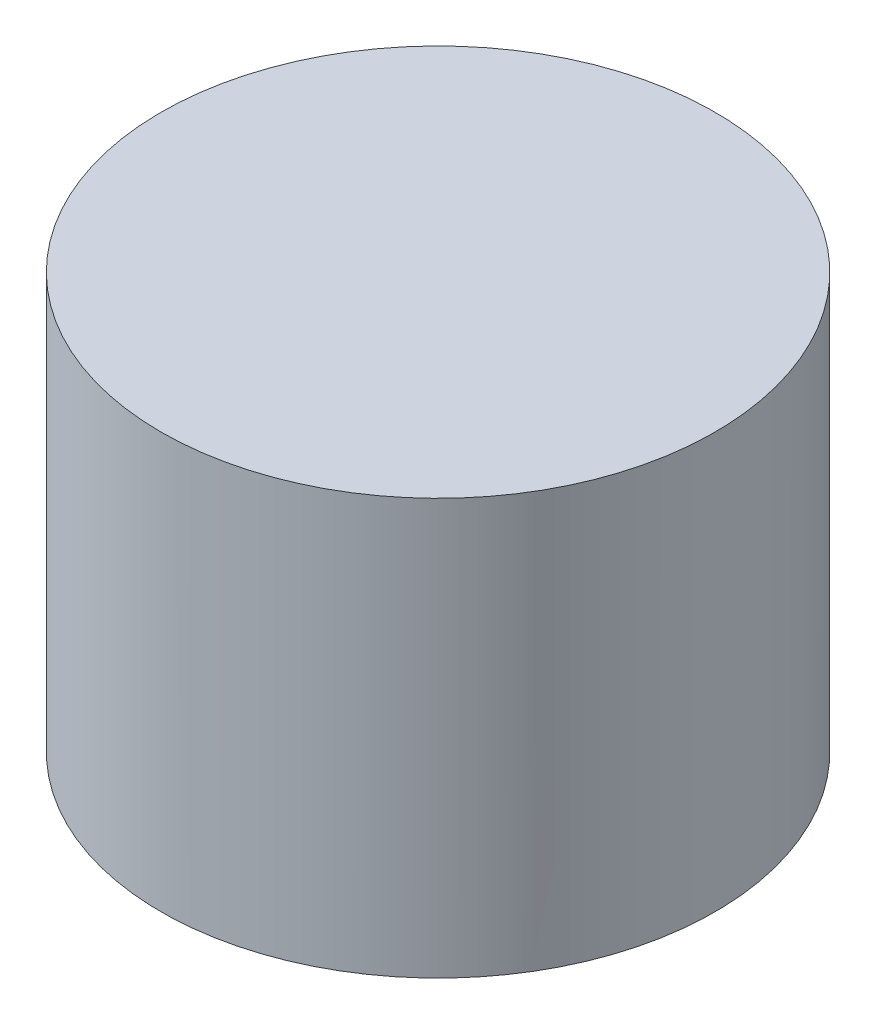
ISO-10303-21;
HEADER;
FILE_DESCRIPTION(('STEP AP214'),'2;1');
FILE_NAME('part.step','',(''),(''),'','','');
FILE_SCHEMA(('AUTOMOTIVE_DESIGN { 1 0 10303 214 1 1 1 1 }'));
ENDSEC;
DATA;
#1=APPLICATION_CONTEXT('core data for automotive mechanical design processes');
#2=APPLICATION_PROTOCOL_DEFINITION('international standard','automotive_design',2000,#1);
#3=PRODUCT_CONTEXT('',#1,'mechanical');
#4=PRODUCT('Part','Part','',(#3));
#5=PRODUCT_RELATED_PRODUCT_CATEGORY('part','',(#4));
#6=PRODUCT_DEFINITION_FORMATION('','',#4);
#7=PRODUCT_DEFINITION_CONTEXT('part definition',#1,'design');
#8=PRODUCT_DEFINITION('design','',#6,#7);
#9=PRODUCT_DEFINITION_SHAPE('','',#8);
#10=(LENGTH_UNIT() NAMED_UNIT(*) SI_UNIT(.MILLI.,.METRE.));
#11=(NAMED_UNIT(*) PLANE_ANGLE_UNIT() SI_UNIT($,.RADIAN.));
#12=(NAMED_UNIT(*) SI_UNIT($,.STERADIAN.) SOLID_ANGLE_UNIT());
#13=UNCERTAINTY_MEASURE_WITH_UNIT(LENGTH_MEASURE(1.E-05),#10,'distance_accuracy_value','');
#14=(GEOMETRIC_REPRESENTATION_CONTEXT(3) GLOBAL_UNCERTAINTY_ASSIGNED_CONTEXT((#13)) GLOBAL_UNIT_ASSIGNED_CONTEXT((#10,
#11,#12)) REPRESENTATION_CONTEXT('',''));
#15=CARTESIAN_POINT('',(0.,0.,0.));
#16=DIRECTION('',(0.,0.,1.));
#17=DIRECTION('',(1.,0.,0.));
#18=AXIS2_PLACEMENT_3D('',#15,#16,#17);
#19=CARTESIAN_POINT('',(0.,0.,0.));
#20=DIRECTION('',(0.,1.,0.));
#21=DIRECTION('',(0.,0.,1.));
#22=AXIS2_PLACEMENT_3D('',#19,#20,#21);
#23=PLANE('',#22);
#24=CARTESIAN_POINT('',(0.,0.,0.));
#25=DIRECTION('',(0.,-1.,0.));
#26=DIRECTION('',(0.,0.,-1.));
#27=AXIS2_PLACEMENT_3D('',#24,#25,#26);
#28=CIRCLE('',#27,7.5);
#29=CARTESIAN_POINT('',(6.5,0.,-3.74165738677393));
#30=VERTEX_POINT('',#29);
#31=CARTESIAN_POINT('',(-6.5,0.,-3.74165738677393));
#32=VERTEX_POINT('',#31);
#33=EDGE_CURVE('E269',#30,#32,#28,.T.);
#34=ORIENTED_EDGE('',*,*,#33,.F.);
#35=DIRECTION('',(0.,0.,1.));
#36=VECTOR('',#35,1.);
#37=CARTESIAN_POINT('',(6.5,0.,-20.));
#38=LINE('',#37,#36);
#39=CARTESIAN_POINT('',(6.5,0.,-18.9142803193777));
#40=VERTEX_POINT('',#39);
#41=EDGE_CURVE('E204',#40,#30,#38,.T.);
#42=ORIENTED_EDGE('',*,*,#41,.F.);
#43=CARTESIAN_POINT('',(0.,0.,0.));
#44=DIRECTION('',(0.,1.,0.));
#45=DIRECTION('',(0.,0.,1.));
#46=AXIS2_PLACEMENT_3D('',#43,#44,#45);
#47=CIRCLE('',#46,20.);
#48=CARTESIAN_POINT('',(-6.5,0.,-18.9142803193777));
#49=VERTEX_POINT('',#48);
#50=EDGE_CURVE('E318',#49,#40,#47,.T.);
#51=ORIENTED_EDGE('',*,*,#50,.F.);
#52=DIRECTION('',(0.,0.,1.));
#53=VECTOR('',#52,1.);
#54=CARTESIAN_POINT('',(-6.5,0.,-20.));
#55=LINE('',#54,#53);
#56=EDGE_CURVE('E208',#49,#32,#55,.T.);
#57=ORIENTED_EDGE('',*,*,#56,.T.);
#58=EDGE_LOOP('',(#34,#42,#51,#57));
#59=FACE_BOUND('',#58,.T.);
#60=ADVANCED_FACE('F41',(#59),#23,.F.);
#61=CARTESIAN_POINT('',(0.,10.,0.));
#62=DIRECTION('',(0.,-1.,0.));
#63=DIRECTION('',(0.,0.,-1.));
#64=AXIS2_PLACEMENT_3D('',#61,#62,#63);
#65=CYLINDRICAL_SURFACE('',#64,20.);
#66=ORIENTED_EDGE('',*,*,#50,.T.);
#67=DIRECTION('',(0.,-1.,0.));
#68=VECTOR('',#67,1.);
#69=CARTESIAN_POINT('',(6.5,10.,-18.9142803193777));
#70=LINE('',#69,#68);
#71=CARTESIAN_POINT('',(6.5,15.,-18.9142803193777));
#72=VERTEX_POINT('',#71);
#73=EDGE_CURVE('E265',#40,#72,#70,.F.);
#74=ORIENTED_EDGE('',*,*,#73,.T.);
#75=CARTESIAN_POINT('',(0.,15.,0.));
#76=DIRECTION('',(0.,-1.,0.));
#77=DIRECTION('',(1.,0.,0.));
#78=AXIS2_PLACEMENT_3D('',#75,#76,#77);
#79=CIRCLE('',#78,20.);
#80=CARTESIAN_POINT('',(12.5,15.,-15.612494995996));
#81=VERTEX_POINT('',#80);
#82=EDGE_CURVE('E255',#72,#81,#79,.T.);
#83=ORIENTED_EDGE('',*,*,#82,.T.);
#84=DIRECTION('',(0.,-1.,0.));
#85=VECTOR('',#84,1.);
#86=CARTESIAN_POINT('',(12.5,10.,-15.612494995996));
#87=LINE('',#86,#85);
#88=CARTESIAN_POINT('',(12.5,25.,-15.612494995996));
#89=VERTEX_POINT('',#88);
#90=EDGE_CURVE('E11',#81,#89,#87,.F.);
#91=ORIENTED_EDGE('',*,*,#90,.T.);
#92=CARTESIAN_POINT('',(0.,25.,0.));
#93=DIRECTION('',(0.,1.,0.));
#94=DIRECTION('',(0.,0.,1.));
#95=AXIS2_PLACEMENT_3D('',#92,#93,#94);
#96=CIRCLE('',#95,20.);
#97=CARTESIAN_POINT('',(-12.5,25.,-15.612494995996));
#98=VERTEX_POINT('',#97);
#99=EDGE_CURVE('E231',#89,#98,#96,.T.);
#100=ORIENTED_EDGE('',*,*,#99,.T.);
#101=DIRECTION('',(0.,-1.,0.));
#102=VECTOR('',#101,1.);
#103=CARTESIAN_POINT('',(-12.5,10.,-15.612494995996));
#104=LINE('',#103,#102);
#105=CARTESIAN_POINT('',(-12.5,15.,-15.612494995996));
#106=VERTEX_POINT('',#105);
#107=EDGE_CURVE('E50',#98,#106,#104,.T.);
#108=ORIENTED_EDGE('',*,*,#107,.T.);
#109=CARTESIAN_POINT('',(0.,15.,0.));
#110=DIRECTION('',(0.,-1.,0.));
#111=DIRECTION('',(1.,0.,0.));
#112=AXIS2_PLACEMENT_3D('',#109,#110,#111);
#113=CIRCLE('',#112,20.);
#114=CARTESIAN_POINT('',(-6.5,15.,-18.9142803193777));
#115=VERTEX_POINT('',#114);
#116=EDGE_CURVE('E238',#106,#115,#113,.T.);
#117=ORIENTED_EDGE('',*,*,#116,.T.);
#118=DIRECTION('',(0.,-1.,0.));
#119=VECTOR('',#118,1.);
#120=CARTESIAN_POINT('',(-6.5,10.,-18.9142803193777));
#121=LINE('',#120,#119);
#122=EDGE_CURVE('E249',#115,#49,#121,.T.);
#123=ORIENTED_EDGE('',*,*,#122,.T.);
#124=EDGE_LOOP('',(#66,#74,#83,#91,#100,#108,#117,#123));
#125=FACE_BOUND('',#124,.T.);
#126=CARTESIAN_POINT('',(0.,30.,0.));
#127=DIRECTION('',(0.,1.,0.));
#128=DIRECTION('',(0.,0.,1.));
#129=AXIS2_PLACEMENT_3D('',#126,#127,#128);
#130=CIRCLE('',#129,20.);
#131=CARTESIAN_POINT('',(0.,30.,20.));
#132=VERTEX_POINT('',#131);
#133=EDGE_CURVE('E274',#132,#132,#130,.T.);
#134=ORIENTED_EDGE('',*,*,#133,.F.);
#135=EDGE_LOOP('',(#134));
#136=FACE_BOUND('',#135,.T.);
#137=ADVANCED_FACE('F43',(#125,#136),#65,.T.);
#138=CARTESIAN_POINT('',(0.,30.,0.));
#139=DIRECTION('',(0.,1.,0.));
#140=DIRECTION('',(0.,0.,1.));
#141=AXIS2_PLACEMENT_3D('',#138,#139,#140);
#142=PLANE('',#141);
#143=ORIENTED_EDGE('',*,*,#133,.T.);
#144=EDGE_LOOP('',(#143));
#145=FACE_BOUND('',#144,.T.);
#146=ADVANCED_FACE('F418',(#145),#142,.T.);
#147=CARTESIAN_POINT('',(0.,15.,0.));
#148=DIRECTION('',(0.,-1.,0.));
#149=DIRECTION('',(0.,0.,-1.));
#150=AXIS2_PLACEMENT_3D('',#147,#148,#149);
#151=CYLINDRICAL_SURFACE('',#150,7.5);
#152=CARTESIAN_POINT('',(0.,5.,0.));
#153=DIRECTION('',(0.,1.,0.));
#154=DIRECTION('',(0.,0.,1.));
#155=AXIS2_PLACEMENT_3D('',#152,#153,#154);
#156=CIRCLE('',#155,7.5);
#157=CARTESIAN_POINT('',(-6.5,5.,-3.74165738677394));
#158=VERTEX_POINT('',#157);
#159=CARTESIAN_POINT('',(6.5,5.,-3.74165738677394));
#160=VERTEX_POINT('',#159);
#161=EDGE_CURVE('E273',#158,#160,#156,.T.);
#162=ORIENTED_EDGE('',*,*,#161,.T.);
#163=DIRECTION('',(0.,-1.,0.));
#164=VECTOR('',#163,1.);
#165=CARTESIAN_POINT('',(6.5,15.,-3.74165738677395));
#166=LINE('',#165,#164);
#167=EDGE_CURVE('E261',#160,#30,#166,.T.);
#168=ORIENTED_EDGE('',*,*,#167,.T.);
#169=ORIENTED_EDGE('',*,*,#33,.T.);
#170=DIRECTION('',(0.,-1.,0.));
#171=VECTOR('',#170,1.);
#172=CARTESIAN_POINT('',(-6.5,15.,-3.74165738677394));
#173=LINE('',#172,#171);
#174=EDGE_CURVE('E245',#32,#158,#173,.F.);
#175=ORIENTED_EDGE('',*,*,#174,.T.);
#176=EDGE_LOOP('',(#162,#168,#169,#175));
#177=FACE_BOUND('',#176,.T.);
#178=ADVANCED_FACE('F392',(#177),#151,.F.);
#179=CARTESIAN_POINT('',(0.,5.,0.));
#180=DIRECTION('',(0.,1.,0.));
#181=DIRECTION('',(0.,0.,1.));
#182=AXIS2_PLACEMENT_3D('',#179,#180,#181);
#183=PLANE('',#182);
#184=DIRECTION('',(0.,0.,-1.));
#185=VECTOR('',#184,1.);
#186=CARTESIAN_POINT('',(6.5,5.,0.));
#187=LINE('',#186,#185);
#188=CARTESIAN_POINT('',(6.5,5.,-7.81145797636738));
#189=VERTEX_POINT('',#188);
#190=EDGE_CURVE('E258',#160,#189,#187,.T.);
#191=ORIENTED_EDGE('',*,*,#190,.F.);
#192=ORIENTED_EDGE('',*,*,#161,.F.);
#193=DIRECTION('',(0.,0.,1.));
#194=VECTOR('',#193,1.);
#195=CARTESIAN_POINT('',(-6.5,5.,0.));
#196=LINE('',#195,#194);
#197=CARTESIAN_POINT('',(-6.5,5.,-7.77765896770314));
#198=VERTEX_POINT('',#197);
#199=EDGE_CURVE('E242',#198,#158,#196,.T.);
#200=ORIENTED_EDGE('',*,*,#199,.F.);
#201=DIRECTION('',(-0.861769355638638,0.,0.507300283542367));
#202=VECTOR('',#201,1.);
#203=CARTESIAN_POINT('',(-0.0975751408502854,5.,-11.546593109018));
#204=LINE('',#203,#202);
#205=CARTESIAN_POINT('',(-10.0484305299971,5.,-5.6887940037548));
#206=VERTEX_POINT('',#205);
#207=EDGE_CURVE('E304',#198,#206,#204,.T.);
#208=ORIENTED_EDGE('',*,*,#207,.T.);
#209=DIRECTION('',(0.00845025507541919,0.,0.999964295957191));
#210=VECTOR('',#209,1.);
#211=CARTESIAN_POINT('',(-10.0484305299971,5.,-5.6887940037548));
#212=LINE('',#211,#210);
#213=CARTESIAN_POINT('',(-9.95085538914677,5.,5.85779910526318));
#214=VERTEX_POINT('',#213);
#215=EDGE_CURVE('E307',#206,#214,#212,.T.);
#216=ORIENTED_EDGE('',*,*,#215,.T.);
#217=DIRECTION('',(0.870219610714058,0.,0.492664012414824));
#218=VECTOR('',#217,1.);
#219=CARTESIAN_POINT('',(-9.95085538914677,5.,5.85779910526318));
#220=LINE('',#219,#218);
#221=CARTESIAN_POINT('',(0.0975751408502837,5.,11.546593109018));
#222=VERTEX_POINT('',#221);
#223=EDGE_CURVE('E311',#214,#222,#220,.T.);
#224=ORIENTED_EDGE('',*,*,#223,.T.);
#225=DIRECTION('',(0.861769355638639,0.,-0.507300283542367));
#226=VECTOR('',#225,1.);
#227=CARTESIAN_POINT('',(0.0975751408502837,5.,11.546593109018));
#228=LINE('',#227,#226);
#229=CARTESIAN_POINT('',(10.048430529997,5.,5.68879400375479));
#230=VERTEX_POINT('',#229);
#231=EDGE_CURVE('E292',#222,#230,#228,.T.);
#232=ORIENTED_EDGE('',*,*,#231,.T.);
#233=DIRECTION('',(-0.00845025507541933,0.,-0.999964295957191));
#234=VECTOR('',#233,1.);
#235=CARTESIAN_POINT('',(10.048430529997,5.,5.68879400375479));
#236=LINE('',#235,#234);
#237=CARTESIAN_POINT('',(9.95085538914676,5.,-5.85779910526318));
#238=VERTEX_POINT('',#237);
#239=EDGE_CURVE('E296',#230,#238,#236,.T.);
#240=ORIENTED_EDGE('',*,*,#239,.T.);
#241=DIRECTION('',(-0.870219610714058,0.,-0.492664012414824));
#242=VECTOR('',#241,1.);
#243=CARTESIAN_POINT('',(9.95085538914676,5.,-5.85779910526318));
#244=LINE('',#243,#242);
#245=EDGE_CURVE('E300',#238,#189,#244,.T.);
#246=ORIENTED_EDGE('',*,*,#245,.T.);
#247=EDGE_LOOP('',(#191,#192,#200,#208,#216,#224,#232,#240,#246));
#248=FACE_BOUND('',#247,.T.);
#249=ADVANCED_FACE('F395',(#248),#183,.T.);
#250=CARTESIAN_POINT('',(0.0975751408502837,5.,11.546593109018));
#251=DIRECTION('',(0.507300283542367,0.,0.861769355638638));
#252=DIRECTION('',(0.861769355638638,0.,-0.507300283542367));
#253=AXIS2_PLACEMENT_3D('',#250,#251,#252);
#254=PLANE('',#253);
#255=DIRECTION('',(0.,1.,0.));
#256=VECTOR('',#255,1.);
#257=CARTESIAN_POINT('',(0.0975751408502837,5.,11.546593109018));
#258=LINE('',#257,#256);
#259=CARTESIAN_POINT('',(0.0975751408502837,25.,11.546593109018));
#260=VERTEX_POINT('',#259);
#261=EDGE_CURVE('E65',#222,#260,#258,.T.);
#262=ORIENTED_EDGE('',*,*,#261,.T.);
#263=DIRECTION('',(0.861769355638639,0.,-0.507300283542367));
#264=VECTOR('',#263,1.);
#265=CARTESIAN_POINT('',(0.0975751408502837,25.,11.546593109018));
#266=LINE('',#265,#264);
#267=CARTESIAN_POINT('',(10.048430529997,25.,5.68879400375479));
#268=VERTEX_POINT('',#267);
#269=EDGE_CURVE('E284',#260,#268,#266,.T.);
#270=ORIENTED_EDGE('',*,*,#269,.T.);
#271=DIRECTION('',(0.,1.,0.));
#272=VECTOR('',#271,1.);
#273=CARTESIAN_POINT('',(10.048430529997,5.,5.68879400375479));
#274=LINE('',#273,#272);
#275=EDGE_CURVE('E315',#230,#268,#274,.T.);
#276=ORIENTED_EDGE('',*,*,#275,.F.);
#277=ORIENTED_EDGE('',*,*,#231,.F.);
#278=EDGE_LOOP('',(#262,#270,#276,#277));
#279=FACE_BOUND('',#278,.T.);
#280=ADVANCED_FACE('F403',(#279),#254,.F.);
#281=CARTESIAN_POINT('',(10.048430529997,5.,5.68879400375479));
#282=DIRECTION('',(0.999964295957191,0.,-0.00845025507541933));
#283=DIRECTION('',(-0.00845025507541933,0.,-0.999964295957191));
#284=AXIS2_PLACEMENT_3D('',#281,#282,#283);
#285=PLANE('',#284);
#286=DIRECTION('',(0.,-1.,0.));
#287=VECTOR('',#286,1.);
#288=CARTESIAN_POINT('',(10.0003570531763,5.,0.));
#289=LINE('',#288,#287);
#290=CARTESIAN_POINT('',(10.0003570531763,25.,0.));
#291=VERTEX_POINT('',#290);
#292=CARTESIAN_POINT('',(10.0003570531763,15.,0.));
#293=VERTEX_POINT('',#292);
#294=EDGE_CURVE('E228',#291,#293,#289,.T.);
#295=ORIENTED_EDGE('',*,*,#294,.T.);
#296=DIRECTION('',(-0.00845025507541933,0.,-0.999964295957191));
#297=VECTOR('',#296,1.);
#298=CARTESIAN_POINT('',(10.048430529997,15.,5.68879400375479));
#299=LINE('',#298,#297);
#300=CARTESIAN_POINT('',(9.95085538914676,15.,-5.85779910526318));
#301=VERTEX_POINT('',#300);
#302=EDGE_CURVE('E181',#293,#301,#299,.T.);
#303=ORIENTED_EDGE('',*,*,#302,.T.);
#304=DIRECTION('',(0.,1.,0.));
#305=VECTOR('',#304,1.);
#306=CARTESIAN_POINT('',(9.95085538914676,5.,-5.85779910526318));
#307=LINE('',#306,#305);
#308=EDGE_CURVE('E327',#238,#301,#307,.T.);
#309=ORIENTED_EDGE('',*,*,#308,.F.);
#310=ORIENTED_EDGE('',*,*,#239,.F.);
#311=ORIENTED_EDGE('',*,*,#275,.T.);
#312=DIRECTION('',(-0.00845025507541933,0.,-0.999964295957191));
#313=VECTOR('',#312,1.);
#314=CARTESIAN_POINT('',(10.048430529997,25.,5.68879400375479));
#315=LINE('',#314,#313);
#316=EDGE_CURVE('E288',#268,#291,#315,.T.);
#317=ORIENTED_EDGE('',*,*,#316,.T.);
#318=EDGE_LOOP('',(#295,#303,#309,#310,#311,#317));
#319=FACE_BOUND('',#318,.T.);
#320=ADVANCED_FACE('F400',(#319),#285,.F.);
#321=CARTESIAN_POINT('',(9.95085538914676,5.,-5.85779910526318));
#322=DIRECTION('',(0.492664012414824,0.,-0.870219610714058));
#323=DIRECTION('',(-0.870219610714058,0.,-0.492664012414824));
#324=AXIS2_PLACEMENT_3D('',#321,#322,#323);
#325=PLANE('',#324);
#326=DIRECTION('',(-0.870219610714058,0.,-0.492664012414824));
#327=VECTOR('',#326,1.);
#328=CARTESIAN_POINT('',(9.95085538914675,15.,-5.85779910526319));
#329=LINE('',#328,#327);
#330=CARTESIAN_POINT('',(6.5,15.,-7.81145797636739));
#331=VERTEX_POINT('',#330);
#332=EDGE_CURVE('E348',#301,#331,#329,.T.);
#333=ORIENTED_EDGE('',*,*,#332,.T.);
#334=DIRECTION('',(0.,-1.,0.));
#335=VECTOR('',#334,1.);
#336=CARTESIAN_POINT('',(6.5,5.,-7.81145797636738));
#337=LINE('',#336,#335);
#338=EDGE_CURVE('E352',#331,#189,#337,.T.);
#339=ORIENTED_EDGE('',*,*,#338,.T.);
#340=ORIENTED_EDGE('',*,*,#245,.F.);
#341=ORIENTED_EDGE('',*,*,#308,.T.);
#342=EDGE_LOOP('',(#333,#339,#340,#341));
#343=FACE_BOUND('',#342,.T.);
#344=ADVANCED_FACE('F398',(#343),#325,.F.);
#345=CARTESIAN_POINT('',(-0.0975751408502854,5.,-11.546593109018));
#346=DIRECTION('',(-0.507300283542367,0.,-0.861769355638639));
#347=DIRECTION('',(-0.861769355638639,0.,0.507300283542367));
#348=AXIS2_PLACEMENT_3D('',#345,#346,#347);
#349=PLANE('',#348);
#350=ORIENTED_EDGE('',*,*,#207,.F.);
#351=DIRECTION('',(0.,1.,0.));
#352=VECTOR('',#351,1.);
#353=CARTESIAN_POINT('',(-6.5,5.,-7.77765896770314));
#354=LINE('',#353,#352);
#355=CARTESIAN_POINT('',(-6.5,15.,-7.77765896770314));
#356=VERTEX_POINT('',#355);
#357=EDGE_CURVE('E344',#198,#356,#354,.T.);
#358=ORIENTED_EDGE('',*,*,#357,.T.);
#359=DIRECTION('',(-0.861769355638639,0.,0.507300283542367));
#360=VECTOR('',#359,1.);
#361=CARTESIAN_POINT('',(-0.0975751408502768,15.,-11.546593109018));
#362=LINE('',#361,#360);
#363=CARTESIAN_POINT('',(-10.0484305299971,15.,-5.6887940037548));
#364=VERTEX_POINT('',#363);
#365=EDGE_CURVE('E234',#356,#364,#362,.T.);
#366=ORIENTED_EDGE('',*,*,#365,.T.);
#367=DIRECTION('',(0.,1.,0.));
#368=VECTOR('',#367,1.);
#369=CARTESIAN_POINT('',(-10.0484305299971,5.,-5.6887940037548));
#370=LINE('',#369,#368);
#371=EDGE_CURVE('E323',#206,#364,#370,.T.);
#372=ORIENTED_EDGE('',*,*,#371,.F.);
#373=EDGE_LOOP('',(#350,#358,#366,#372));
#374=FACE_BOUND('',#373,.T.);
#375=ADVANCED_FACE('F378',(#374),#349,.F.);
#376=CARTESIAN_POINT('',(-10.0484305299971,5.,-5.6887940037548));
#377=DIRECTION('',(-0.999964295957191,0.,0.00845025507541919));
#378=DIRECTION('',(0.00845025507541919,0.,0.999964295957191));
#379=AXIS2_PLACEMENT_3D('',#376,#377,#378);
#380=PLANE('',#379);
#381=ORIENTED_EDGE('',*,*,#371,.T.);
#382=DIRECTION('',(0.00845025507541919,0.,0.999964295957191));
#383=VECTOR('',#382,1.);
#384=CARTESIAN_POINT('',(-10.0484305299971,15.,-5.6887940037548));
#385=LINE('',#384,#383);
#386=CARTESIAN_POINT('',(-10.0003570531763,15.,0.));
#387=VERTEX_POINT('',#386);
#388=EDGE_CURVE('E337',#364,#387,#385,.T.);
#389=ORIENTED_EDGE('',*,*,#388,.T.);
#390=DIRECTION('',(0.,1.,0.));
#391=VECTOR('',#390,1.);
#392=CARTESIAN_POINT('',(-10.0003570531763,5.,0.));
#393=LINE('',#392,#391);
#394=CARTESIAN_POINT('',(-10.0003570531763,25.,0.));
#395=VERTEX_POINT('',#394);
#396=EDGE_CURVE('E207',#387,#395,#393,.T.);
#397=ORIENTED_EDGE('',*,*,#396,.T.);
#398=DIRECTION('',(0.00845025507541919,0.,0.999964295957191));
#399=VECTOR('',#398,1.);
#400=CARTESIAN_POINT('',(-10.0484305299971,25.,-5.6887940037548));
#401=LINE('',#400,#399);
#402=CARTESIAN_POINT('',(-9.95085538914677,25.,5.85779910526318));
#403=VERTEX_POINT('',#402);
#404=EDGE_CURVE('E278',#395,#403,#401,.T.);
#405=ORIENTED_EDGE('',*,*,#404,.T.);
#406=DIRECTION('',(0.,1.,0.));
#407=VECTOR('',#406,1.);
#408=CARTESIAN_POINT('',(-9.95085538914677,5.,5.85779910526318));
#409=LINE('',#408,#407);
#410=EDGE_CURVE('E319',#214,#403,#409,.T.);
#411=ORIENTED_EDGE('',*,*,#410,.F.);
#412=ORIENTED_EDGE('',*,*,#215,.F.);
#413=EDGE_LOOP('',(#381,#389,#397,#405,#411,#412));
#414=FACE_BOUND('',#413,.T.);
#415=ADVANCED_FACE('F373',(#414),#380,.F.);
#416=CARTESIAN_POINT('',(-9.95085538914677,5.,5.85779910526318));
#417=DIRECTION('',(-0.492664012414824,0.,0.870219610714058));
#418=DIRECTION('',(0.870219610714058,0.,0.492664012414824));
#419=AXIS2_PLACEMENT_3D('',#416,#417,#418);
#420=PLANE('',#419);
#421=ORIENTED_EDGE('',*,*,#410,.T.);
#422=DIRECTION('',(0.870219610714058,0.,0.492664012414824));
#423=VECTOR('',#422,1.);
#424=CARTESIAN_POINT('',(-9.95085538914677,25.,5.85779910526318));
#425=LINE('',#424,#423);
#426=EDGE_CURVE('E281',#403,#260,#425,.T.);
#427=ORIENTED_EDGE('',*,*,#426,.T.);
#428=ORIENTED_EDGE('',*,*,#261,.F.);
#429=ORIENTED_EDGE('',*,*,#223,.F.);
#430=EDGE_LOOP('',(#421,#427,#428,#429));
#431=FACE_BOUND('',#430,.T.);
#432=ADVANCED_FACE('F404',(#431),#420,.F.);
#433=CARTESIAN_POINT('',(0.,25.,0.));
#434=DIRECTION('',(0.,1.,0.));
#435=DIRECTION('',(0.,0.,1.));
#436=AXIS2_PLACEMENT_3D('',#433,#434,#435);
#437=PLANE('',#436);
#438=ORIENTED_EDGE('',*,*,#404,.F.);
#439=DIRECTION('',(-1.,0.,0.));
#440=VECTOR('',#439,1.);
#441=CARTESIAN_POINT('',(-12.5,25.,0.));
#442=LINE('',#441,#440);
#443=CARTESIAN_POINT('',(-12.5,25.,0.));
#444=VERTEX_POINT('',#443);
#445=EDGE_CURVE('E57',#395,#444,#442,.T.);
#446=ORIENTED_EDGE('',*,*,#445,.T.);
#447=DIRECTION('',(0.,0.,1.));
#448=VECTOR('',#447,1.);
#449=CARTESIAN_POINT('',(-12.5,25.,-20.));
#450=LINE('',#449,#448);
#451=EDGE_CURVE('E219',#98,#444,#450,.T.);
#452=ORIENTED_EDGE('',*,*,#451,.F.);
#453=ORIENTED_EDGE('',*,*,#99,.F.);
#454=DIRECTION('',(0.,0.,1.));
#455=VECTOR('',#454,1.);
#456=CARTESIAN_POINT('',(12.5,25.,-20.));
#457=LINE('',#456,#455);
#458=CARTESIAN_POINT('',(12.5,25.,0.));
#459=VERTEX_POINT('',#458);
#460=EDGE_CURVE('E173',#89,#459,#457,.T.);
#461=ORIENTED_EDGE('',*,*,#460,.T.);
#462=EDGE_CURVE('E189',#459,#291,#442,.T.);
#463=ORIENTED_EDGE('',*,*,#462,.T.);
#464=ORIENTED_EDGE('',*,*,#316,.F.);
#465=ORIENTED_EDGE('',*,*,#269,.F.);
#466=ORIENTED_EDGE('',*,*,#426,.F.);
#467=EDGE_LOOP('',(#438,#446,#452,#453,#461,#463,#464,#465,#466));
#468=FACE_BOUND('',#467,.T.);
#469=ADVANCED_FACE('F366',(#468),#437,.F.);
#470=CARTESIAN_POINT('',(-12.5,25.,-20.));
#471=DIRECTION('',(-1.,0.,0.));
#472=DIRECTION('',(0.,-1.,0.));
#473=AXIS2_PLACEMENT_3D('',#470,#471,#472);
#474=PLANE('',#473);
#475=ORIENTED_EDGE('',*,*,#451,.T.);
#476=DIRECTION('',(0.,-1.,0.));
#477=VECTOR('',#476,1.);
#478=CARTESIAN_POINT('',(-12.5,25.,0.));
#479=LINE('',#478,#477);
#480=CARTESIAN_POINT('',(-12.5,15.,0.));
#481=VERTEX_POINT('',#480);
#482=EDGE_CURVE('E196',#444,#481,#479,.T.);
#483=ORIENTED_EDGE('',*,*,#482,.T.);
#484=DIRECTION('',(0.,0.,1.));
#485=VECTOR('',#484,1.);
#486=CARTESIAN_POINT('',(-12.5,15.,-20.));
#487=LINE('',#486,#485);
#488=EDGE_CURVE('E216',#106,#481,#487,.T.);
#489=ORIENTED_EDGE('',*,*,#488,.F.);
#490=ORIENTED_EDGE('',*,*,#107,.F.);
#491=EDGE_LOOP('',(#475,#483,#489,#490));
#492=FACE_BOUND('',#491,.T.);
#493=ADVANCED_FACE('F363',(#492),#474,.F.);
#494=CARTESIAN_POINT('',(12.5,25.,-20.));
#495=DIRECTION('',(1.,0.,0.));
#496=DIRECTION('',(0.,1.,0.));
#497=AXIS2_PLACEMENT_3D('',#494,#495,#496);
#498=PLANE('',#497);
#499=DIRECTION('',(0.,0.,1.));
#500=VECTOR('',#499,1.);
#501=CARTESIAN_POINT('',(12.5,15.,-20.));
#502=LINE('',#501,#500);
#503=CARTESIAN_POINT('',(12.5,15.,0.));
#504=VERTEX_POINT('',#503);
#505=EDGE_CURVE('E164',#81,#504,#502,.T.);
#506=ORIENTED_EDGE('',*,*,#505,.T.);
#507=DIRECTION('',(0.,1.,0.));
#508=VECTOR('',#507,1.);
#509=CARTESIAN_POINT('',(12.5,25.,0.));
#510=LINE('',#509,#508);
#511=EDGE_CURVE('E169',#504,#459,#510,.T.);
#512=ORIENTED_EDGE('',*,*,#511,.T.);
#513=ORIENTED_EDGE('',*,*,#460,.F.);
#514=ORIENTED_EDGE('',*,*,#90,.F.);
#515=EDGE_LOOP('',(#506,#512,#513,#514));
#516=FACE_BOUND('',#515,.T.);
#517=ADVANCED_FACE('F166',(#516),#498,.F.);
#518=CARTESIAN_POINT('',(6.5,15.,-20.));
#519=DIRECTION('',(1.,0.,0.));
#520=DIRECTION('',(0.,1.,0.));
#521=AXIS2_PLACEMENT_3D('',#518,#519,#520);
#522=PLANE('',#521);
#523=ORIENTED_EDGE('',*,*,#41,.T.);
#524=ORIENTED_EDGE('',*,*,#167,.F.);
#525=ORIENTED_EDGE('',*,*,#190,.T.);
#526=ORIENTED_EDGE('',*,*,#338,.F.);
#527=DIRECTION('',(0.,0.,1.));
#528=VECTOR('',#527,1.);
#529=CARTESIAN_POINT('',(6.5,15.,-20.));
#530=LINE('',#529,#528);
#531=EDGE_CURVE('E174',#72,#331,#530,.T.);
#532=ORIENTED_EDGE('',*,*,#531,.F.);
#533=ORIENTED_EDGE('',*,*,#73,.F.);
#534=EDGE_LOOP('',(#523,#524,#525,#526,#532,#533));
#535=FACE_BOUND('',#534,.T.);
#536=ADVANCED_FACE('F388',(#535),#522,.F.);
#537=CARTESIAN_POINT('',(6.5,15.,-20.));
#538=DIRECTION('',(0.,-1.,0.));
#539=DIRECTION('',(1.,0.,0.));
#540=AXIS2_PLACEMENT_3D('',#537,#538,#539);
#541=PLANE('',#540);
#542=ORIENTED_EDGE('',*,*,#531,.T.);
#543=ORIENTED_EDGE('',*,*,#332,.F.);
#544=ORIENTED_EDGE('',*,*,#302,.F.);
#545=DIRECTION('',(1.,0.,0.));
#546=VECTOR('',#545,1.);
#547=CARTESIAN_POINT('',(6.5,15.,0.));
#548=LINE('',#547,#546);
#549=EDGE_CURVE('E177',#293,#504,#548,.T.);
#550=ORIENTED_EDGE('',*,*,#549,.T.);
#551=ORIENTED_EDGE('',*,*,#505,.F.);
#552=ORIENTED_EDGE('',*,*,#82,.F.);
#553=EDGE_LOOP('',(#542,#543,#544,#550,#551,#552));
#554=FACE_BOUND('',#553,.T.);
#555=ADVANCED_FACE('F179',(#554),#541,.F.);
#556=CARTESIAN_POINT('',(-6.5,15.,-20.));
#557=DIRECTION('',(-1.,0.,0.));
#558=DIRECTION('',(0.,-1.,0.));
#559=AXIS2_PLACEMENT_3D('',#556,#557,#558);
#560=PLANE('',#559);
#561=DIRECTION('',(0.,0.,1.));
#562=VECTOR('',#561,1.);
#563=CARTESIAN_POINT('',(-6.5,15.,-20.));
#564=LINE('',#563,#562);
#565=EDGE_CURVE('E212',#115,#356,#564,.T.);
#566=ORIENTED_EDGE('',*,*,#565,.T.);
#567=ORIENTED_EDGE('',*,*,#357,.F.);
#568=ORIENTED_EDGE('',*,*,#199,.T.);
#569=ORIENTED_EDGE('',*,*,#174,.F.);
#570=ORIENTED_EDGE('',*,*,#56,.F.);
#571=ORIENTED_EDGE('',*,*,#122,.F.);
#572=EDGE_LOOP('',(#566,#567,#568,#569,#570,#571));
#573=FACE_BOUND('',#572,.T.);
#574=ADVANCED_FACE('F381',(#573),#560,.F.);
#575=CARTESIAN_POINT('',(-12.5,15.,-20.));
#576=DIRECTION('',(0.,-1.,0.));
#577=DIRECTION('',(1.,0.,0.));
#578=AXIS2_PLACEMENT_3D('',#575,#576,#577);
#579=PLANE('',#578);
#580=ORIENTED_EDGE('',*,*,#488,.T.);
#581=DIRECTION('',(1.,0.,0.));
#582=VECTOR('',#581,1.);
#583=CARTESIAN_POINT('',(-12.5,15.,0.));
#584=LINE('',#583,#582);
#585=EDGE_CURVE('E200',#481,#387,#584,.T.);
#586=ORIENTED_EDGE('',*,*,#585,.T.);
#587=ORIENTED_EDGE('',*,*,#388,.F.);
#588=ORIENTED_EDGE('',*,*,#365,.F.);
#589=ORIENTED_EDGE('',*,*,#565,.F.);
#590=ORIENTED_EDGE('',*,*,#116,.F.);
#591=EDGE_LOOP('',(#580,#586,#587,#588,#589,#590));
#592=FACE_BOUND('',#591,.T.);
#593=ADVANCED_FACE('F371',(#592),#579,.F.);
#594=CARTESIAN_POINT('',(0.,0.,0.));
#595=DIRECTION('',(0.,0.,1.));
#596=DIRECTION('',(1.,0.,0.));
#597=AXIS2_PLACEMENT_3D('',#594,#595,#596);
#598=PLANE('',#597);
#599=ORIENTED_EDGE('',*,*,#462,.F.);
#600=ORIENTED_EDGE('',*,*,#511,.F.);
#601=ORIENTED_EDGE('',*,*,#549,.F.);
#602=ORIENTED_EDGE('',*,*,#294,.F.);
#603=EDGE_LOOP('',(#599,#600,#601,#602));
#604=FACE_BOUND('',#603,.T.);
#605=ADVANCED_FACE('F187',(#604),#598,.F.);
#606=ORIENTED_EDGE('',*,*,#585,.F.);
#607=ORIENTED_EDGE('',*,*,#482,.F.);
#608=ORIENTED_EDGE('',*,*,#445,.F.);
#609=ORIENTED_EDGE('',*,*,#396,.F.);
#610=EDGE_LOOP('',(#606,#607,#608,#609));
#611=FACE_BOUND('',#610,.T.);
#612=ADVANCED_FACE('F369',(#611),#598,.F.);
#613=CLOSED_SHELL('',(#60,#137,#146,#178,#249,#280,#320,#344,#375,#415,#432,#469,#493,#517,#536,
#555,#574,#593,#605,#612));
#614=MANIFOLD_SOLID_BREP('B2',#613);
#615=ADVANCED_BREP_SHAPE_REPRESENTATION('',(#18,#614),#14);
#616=SHAPE_DEFINITION_REPRESENTATION(#9,#615);
ENDSEC;
END-ISO-10303-21;
